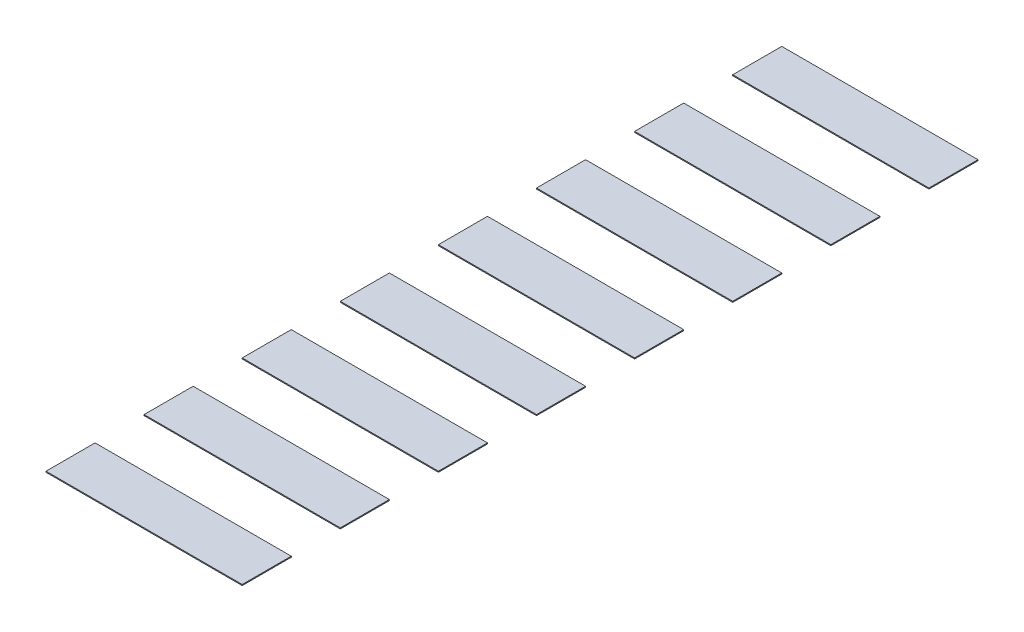
ISO-10303-21;
HEADER;
FILE_DESCRIPTION(('STEP AP214'),'2;1');
FILE_NAME('part.step','',(''),(''),'','','');
FILE_SCHEMA(('AUTOMOTIVE_DESIGN { 1 0 10303 214 1 1 1 1 }'));
ENDSEC;
DATA;
#1=APPLICATION_CONTEXT('core data for automotive mechanical design processes');
#2=APPLICATION_PROTOCOL_DEFINITION('international standard','automotive_design',2000,#1);
#3=PRODUCT_CONTEXT('',#1,'mechanical');
#4=PRODUCT('Part','Part','',(#3));
#5=PRODUCT_RELATED_PRODUCT_CATEGORY('part','',(#4));
#6=PRODUCT_DEFINITION_FORMATION('','',#4);
#7=PRODUCT_DEFINITION_CONTEXT('part definition',#1,'design');
#8=PRODUCT_DEFINITION('design','',#6,#7);
#9=PRODUCT_DEFINITION_SHAPE('','',#8);
#10=(LENGTH_UNIT() NAMED_UNIT(*) SI_UNIT(.MILLI.,.METRE.));
#11=(NAMED_UNIT(*) PLANE_ANGLE_UNIT() SI_UNIT($,.RADIAN.));
#12=(NAMED_UNIT(*) SI_UNIT($,.STERADIAN.) SOLID_ANGLE_UNIT());
#13=UNCERTAINTY_MEASURE_WITH_UNIT(LENGTH_MEASURE(1.E-05),#10,'distance_accuracy_value','');
#14=(GEOMETRIC_REPRESENTATION_CONTEXT(3) GLOBAL_UNCERTAINTY_ASSIGNED_CONTEXT((#13)) GLOBAL_UNIT_ASSIGNED_CONTEXT((#10,
#11,#12)) REPRESENTATION_CONTEXT('',''));
#15=CARTESIAN_POINT('',(0.,0.,0.));
#16=DIRECTION('',(0.,0.,1.));
#17=DIRECTION('',(1.,0.,0.));
#18=AXIS2_PLACEMENT_3D('',#15,#16,#17);
#19=CARTESIAN_POINT('',(0.,0.5,350.));
#20=DIRECTION('',(1.,0.,0.));
#21=DIRECTION('',(0.,0.,-1.));
#22=AXIS2_PLACEMENT_3D('',#19,#20,#21);
#23=PLANE('',#22);
#24=DIRECTION('',(0.,0.,1.));
#25=VECTOR('',#24,1.);
#26=CARTESIAN_POINT('',(0.,0.,350.));
#27=LINE('',#26,#25);
#28=CARTESIAN_POINT('',(0.,0.,350.));
#29=VERTEX_POINT('',#28);
#30=CARTESIAN_POINT('',(0.,0.,375.));
#31=VERTEX_POINT('',#30);
#32=EDGE_CURVE('E109',#29,#31,#27,.T.);
#33=ORIENTED_EDGE('',*,*,#32,.T.);
#34=DIRECTION('',(0.,-1.,0.));
#35=VECTOR('',#34,1.);
#36=CARTESIAN_POINT('',(0.,0.5,375.));
#37=LINE('',#36,#35);
#38=CARTESIAN_POINT('',(0.,0.5,375.));
#39=VERTEX_POINT('',#38);
#40=EDGE_CURVE('E12',#39,#31,#37,.T.);
#41=ORIENTED_EDGE('',*,*,#40,.F.);
#42=DIRECTION('',(0.,0.,1.));
#43=VECTOR('',#42,1.);
#44=CARTESIAN_POINT('',(0.,0.5,350.));
#45=LINE('',#44,#43);
#46=CARTESIAN_POINT('',(0.,0.5,350.));
#47=VERTEX_POINT('',#46);
#48=EDGE_CURVE('E97',#47,#39,#45,.T.);
#49=ORIENTED_EDGE('',*,*,#48,.F.);
#50=DIRECTION('',(0.,-1.,0.));
#51=VECTOR('',#50,1.);
#52=CARTESIAN_POINT('',(0.,0.5,350.));
#53=LINE('',#52,#51);
#54=EDGE_CURVE('E105',#47,#29,#53,.T.);
#55=ORIENTED_EDGE('',*,*,#54,.T.);
#56=EDGE_LOOP('',(#33,#41,#49,#55));
#57=FACE_BOUND('',#56,.T.);
#58=ADVANCED_FACE('F46',(#57),#23,.F.);
#59=CARTESIAN_POINT('',(0.,0.5,375.));
#60=DIRECTION('',(0.,0.,-1.));
#61=DIRECTION('',(-1.,0.,0.));
#62=AXIS2_PLACEMENT_3D('',#59,#60,#61);
#63=PLANE('',#62);
#64=DIRECTION('',(1.,0.,0.));
#65=VECTOR('',#64,1.);
#66=CARTESIAN_POINT('',(0.,0.,375.));
#67=LINE('',#66,#65);
#68=CARTESIAN_POINT('',(100.,0.,375.));
#69=VERTEX_POINT('',#68);
#70=EDGE_CURVE('E101',#31,#69,#67,.T.);
#71=ORIENTED_EDGE('',*,*,#70,.T.);
#72=DIRECTION('',(0.,-1.,0.));
#73=VECTOR('',#72,1.);
#74=CARTESIAN_POINT('',(100.,0.5,375.));
#75=LINE('',#74,#73);
#76=CARTESIAN_POINT('',(100.,0.5,375.));
#77=VERTEX_POINT('',#76);
#78=EDGE_CURVE('E54',#77,#69,#75,.T.);
#79=ORIENTED_EDGE('',*,*,#78,.F.);
#80=DIRECTION('',(1.,0.,0.));
#81=VECTOR('',#80,1.);
#82=CARTESIAN_POINT('',(0.,0.5,375.));
#83=LINE('',#82,#81);
#84=EDGE_CURVE('E92',#39,#77,#83,.T.);
#85=ORIENTED_EDGE('',*,*,#84,.F.);
#86=ORIENTED_EDGE('',*,*,#40,.T.);
#87=EDGE_LOOP('',(#71,#79,#85,#86));
#88=FACE_BOUND('',#87,.T.);
#89=ADVANCED_FACE('F100',(#88),#63,.F.);
#90=CARTESIAN_POINT('',(100.,0.5,350.));
#91=DIRECTION('',(-1.,0.,0.));
#92=DIRECTION('',(0.,0.,1.));
#93=AXIS2_PLACEMENT_3D('',#90,#91,#92);
#94=PLANE('',#93);
#95=DIRECTION('',(0.,0.,-1.));
#96=VECTOR('',#95,1.);
#97=CARTESIAN_POINT('',(100.,0.,350.));
#98=LINE('',#97,#96);
#99=CARTESIAN_POINT('',(100.,0.,350.));
#100=VERTEX_POINT('',#99);
#101=EDGE_CURVE('E79',#69,#100,#98,.T.);
#102=ORIENTED_EDGE('',*,*,#101,.T.);
#103=DIRECTION('',(0.,-1.,0.));
#104=VECTOR('',#103,1.);
#105=CARTESIAN_POINT('',(100.,0.5,350.));
#106=LINE('',#105,#104);
#107=CARTESIAN_POINT('',(100.,0.5,350.));
#108=VERTEX_POINT('',#107);
#109=EDGE_CURVE('E102',#108,#100,#106,.T.);
#110=ORIENTED_EDGE('',*,*,#109,.F.);
#111=DIRECTION('',(0.,0.,-1.));
#112=VECTOR('',#111,1.);
#113=CARTESIAN_POINT('',(100.,0.5,350.));
#114=LINE('',#113,#112);
#115=EDGE_CURVE('E95',#77,#108,#114,.T.);
#116=ORIENTED_EDGE('',*,*,#115,.F.);
#117=ORIENTED_EDGE('',*,*,#78,.T.);
#118=EDGE_LOOP('',(#102,#110,#116,#117));
#119=FACE_BOUND('',#118,.T.);
#120=ADVANCED_FACE('F103',(#119),#94,.F.);
#121=CARTESIAN_POINT('',(0.,0.5,350.));
#122=DIRECTION('',(0.,0.,1.));
#123=DIRECTION('',(1.,0.,0.));
#124=AXIS2_PLACEMENT_3D('',#121,#122,#123);
#125=PLANE('',#124);
#126=DIRECTION('',(-1.,0.,0.));
#127=VECTOR('',#126,1.);
#128=CARTESIAN_POINT('',(0.,0.,350.));
#129=LINE('',#128,#127);
#130=EDGE_CURVE('E85',#100,#29,#129,.T.);
#131=ORIENTED_EDGE('',*,*,#130,.T.);
#132=ORIENTED_EDGE('',*,*,#54,.F.);
#133=DIRECTION('',(-1.,0.,0.));
#134=VECTOR('',#133,1.);
#135=CARTESIAN_POINT('',(0.,0.5,350.));
#136=LINE('',#135,#134);
#137=EDGE_CURVE('E62',#108,#47,#136,.T.);
#138=ORIENTED_EDGE('',*,*,#137,.F.);
#139=ORIENTED_EDGE('',*,*,#109,.T.);
#140=EDGE_LOOP('',(#131,#132,#138,#139));
#141=FACE_BOUND('',#140,.T.);
#142=ADVANCED_FACE('F116',(#141),#125,.F.);
#143=CARTESIAN_POINT('',(0.,0.5,0.));
#144=DIRECTION('',(0.,1.,0.));
#145=DIRECTION('',(0.,0.,1.));
#146=AXIS2_PLACEMENT_3D('',#143,#144,#145);
#147=PLANE('',#146);
#148=ORIENTED_EDGE('',*,*,#48,.T.);
#149=ORIENTED_EDGE('',*,*,#84,.T.);
#150=ORIENTED_EDGE('',*,*,#115,.T.);
#151=ORIENTED_EDGE('',*,*,#137,.T.);
#152=EDGE_LOOP('',(#148,#149,#150,#151));
#153=FACE_BOUND('',#152,.T.);
#154=ADVANCED_FACE('F93',(#153),#147,.T.);
#155=CARTESIAN_POINT('',(0.,0.,0.));
#156=DIRECTION('',(0.,1.,0.));
#157=DIRECTION('',(0.,0.,1.));
#158=AXIS2_PLACEMENT_3D('',#155,#156,#157);
#159=PLANE('',#158);
#160=ORIENTED_EDGE('',*,*,#32,.F.);
#161=ORIENTED_EDGE('',*,*,#130,.F.);
#162=ORIENTED_EDGE('',*,*,#101,.F.);
#163=ORIENTED_EDGE('',*,*,#70,.F.);
#164=EDGE_LOOP('',(#160,#161,#162,#163));
#165=FACE_BOUND('',#164,.T.);
#166=ADVANCED_FACE('F119',(#165),#159,.F.);
#167=CLOSED_SHELL('',(#58,#89,#120,#142,#154,#166));
#168=MANIFOLD_SOLID_BREP('B2',#167);
#169=CARTESIAN_POINT('',(0.,0.5,300.));
#170=DIRECTION('',(0.,0.,1.));
#171=DIRECTION('',(1.,0.,0.));
#172=AXIS2_PLACEMENT_3D('',#169,#170,#171);
#173=PLANE('',#172);
#174=DIRECTION('',(-1.,0.,0.));
#175=VECTOR('',#174,1.);
#176=CARTESIAN_POINT('',(0.,0.,300.));
#177=LINE('',#176,#175);
#178=CARTESIAN_POINT('',(100.,0.,300.));
#179=VERTEX_POINT('',#178);
#180=CARTESIAN_POINT('',(0.,0.,300.));
#181=VERTEX_POINT('',#180);
#182=EDGE_CURVE('E243',#179,#181,#177,.T.);
#183=ORIENTED_EDGE('',*,*,#182,.T.);
#184=DIRECTION('',(0.,-1.,0.));
#185=VECTOR('',#184,1.);
#186=CARTESIAN_POINT('',(0.,0.5,300.));
#187=LINE('',#186,#185);
#188=CARTESIAN_POINT('',(0.,0.5,300.));
#189=VERTEX_POINT('',#188);
#190=EDGE_CURVE('E44',#189,#181,#187,.T.);
#191=ORIENTED_EDGE('',*,*,#190,.F.);
#192=DIRECTION('',(-1.,0.,0.));
#193=VECTOR('',#192,1.);
#194=CARTESIAN_POINT('',(0.,0.5,300.));
#195=LINE('',#194,#193);
#196=CARTESIAN_POINT('',(100.,0.5,300.));
#197=VERTEX_POINT('',#196);
#198=EDGE_CURVE('E231',#197,#189,#195,.T.);
#199=ORIENTED_EDGE('',*,*,#198,.F.);
#200=DIRECTION('',(0.,-1.,0.));
#201=VECTOR('',#200,1.);
#202=CARTESIAN_POINT('',(100.,0.5,300.));
#203=LINE('',#202,#201);
#204=EDGE_CURVE('E239',#197,#179,#203,.T.);
#205=ORIENTED_EDGE('',*,*,#204,.T.);
#206=EDGE_LOOP('',(#183,#191,#199,#205));
#207=FACE_BOUND('',#206,.T.);
#208=ADVANCED_FACE('F180',(#207),#173,.F.);
#209=CARTESIAN_POINT('',(0.,0.5,300.));
#210=DIRECTION('',(1.,0.,0.));
#211=DIRECTION('',(0.,0.,-1.));
#212=AXIS2_PLACEMENT_3D('',#209,#210,#211);
#213=PLANE('',#212);
#214=DIRECTION('',(0.,0.,1.));
#215=VECTOR('',#214,1.);
#216=CARTESIAN_POINT('',(0.,0.,300.));
#217=LINE('',#216,#215);
#218=CARTESIAN_POINT('',(0.,0.,325.));
#219=VERTEX_POINT('',#218);
#220=EDGE_CURVE('E235',#181,#219,#217,.T.);
#221=ORIENTED_EDGE('',*,*,#220,.T.);
#222=DIRECTION('',(0.,-1.,0.));
#223=VECTOR('',#222,1.);
#224=CARTESIAN_POINT('',(0.,0.5,325.));
#225=LINE('',#224,#223);
#226=CARTESIAN_POINT('',(0.,0.5,325.));
#227=VERTEX_POINT('',#226);
#228=EDGE_CURVE('E188',#227,#219,#225,.T.);
#229=ORIENTED_EDGE('',*,*,#228,.F.);
#230=DIRECTION('',(0.,0.,1.));
#231=VECTOR('',#230,1.);
#232=CARTESIAN_POINT('',(0.,0.5,300.));
#233=LINE('',#232,#231);
#234=EDGE_CURVE('E226',#189,#227,#233,.T.);
#235=ORIENTED_EDGE('',*,*,#234,.F.);
#236=ORIENTED_EDGE('',*,*,#190,.T.);
#237=EDGE_LOOP('',(#221,#229,#235,#236));
#238=FACE_BOUND('',#237,.T.);
#239=ADVANCED_FACE('F234',(#238),#213,.F.);
#240=CARTESIAN_POINT('',(0.,0.5,325.));
#241=DIRECTION('',(0.,0.,-1.));
#242=DIRECTION('',(-1.,0.,0.));
#243=AXIS2_PLACEMENT_3D('',#240,#241,#242);
#244=PLANE('',#243);
#245=DIRECTION('',(1.,0.,0.));
#246=VECTOR('',#245,1.);
#247=CARTESIAN_POINT('',(0.,0.,325.));
#248=LINE('',#247,#246);
#249=CARTESIAN_POINT('',(100.,0.,325.));
#250=VERTEX_POINT('',#249);
#251=EDGE_CURVE('E213',#219,#250,#248,.T.);
#252=ORIENTED_EDGE('',*,*,#251,.T.);
#253=DIRECTION('',(0.,-1.,0.));
#254=VECTOR('',#253,1.);
#255=CARTESIAN_POINT('',(100.,0.5,325.));
#256=LINE('',#255,#254);
#257=CARTESIAN_POINT('',(100.,0.5,325.));
#258=VERTEX_POINT('',#257);
#259=EDGE_CURVE('E236',#258,#250,#256,.T.);
#260=ORIENTED_EDGE('',*,*,#259,.F.);
#261=DIRECTION('',(1.,0.,0.));
#262=VECTOR('',#261,1.);
#263=CARTESIAN_POINT('',(0.,0.5,325.));
#264=LINE('',#263,#262);
#265=EDGE_CURVE('E229',#227,#258,#264,.T.);
#266=ORIENTED_EDGE('',*,*,#265,.F.);
#267=ORIENTED_EDGE('',*,*,#228,.T.);
#268=EDGE_LOOP('',(#252,#260,#266,#267));
#269=FACE_BOUND('',#268,.T.);
#270=ADVANCED_FACE('F237',(#269),#244,.F.);
#271=CARTESIAN_POINT('',(100.,0.5,300.));
#272=DIRECTION('',(-1.,0.,0.));
#273=DIRECTION('',(0.,0.,1.));
#274=AXIS2_PLACEMENT_3D('',#271,#272,#273);
#275=PLANE('',#274);
#276=DIRECTION('',(0.,0.,-1.));
#277=VECTOR('',#276,1.);
#278=CARTESIAN_POINT('',(100.,0.,300.));
#279=LINE('',#278,#277);
#280=EDGE_CURVE('E219',#250,#179,#279,.T.);
#281=ORIENTED_EDGE('',*,*,#280,.T.);
#282=ORIENTED_EDGE('',*,*,#204,.F.);
#283=DIRECTION('',(0.,0.,-1.));
#284=VECTOR('',#283,1.);
#285=CARTESIAN_POINT('',(100.,0.5,300.));
#286=LINE('',#285,#284);
#287=EDGE_CURVE('E196',#258,#197,#286,.T.);
#288=ORIENTED_EDGE('',*,*,#287,.F.);
#289=ORIENTED_EDGE('',*,*,#259,.T.);
#290=EDGE_LOOP('',(#281,#282,#288,#289));
#291=FACE_BOUND('',#290,.T.);
#292=ADVANCED_FACE('F250',(#291),#275,.F.);
#293=CARTESIAN_POINT('',(0.,0.5,0.));
#294=DIRECTION('',(0.,-1.,0.));
#295=DIRECTION('',(0.,0.,-1.));
#296=AXIS2_PLACEMENT_3D('',#293,#294,#295);
#297=PLANE('',#296);
#298=ORIENTED_EDGE('',*,*,#198,.T.);
#299=ORIENTED_EDGE('',*,*,#234,.T.);
#300=ORIENTED_EDGE('',*,*,#265,.T.);
#301=ORIENTED_EDGE('',*,*,#287,.T.);
#302=EDGE_LOOP('',(#298,#299,#300,#301));
#303=FACE_BOUND('',#302,.T.);
#304=ADVANCED_FACE('F227',(#303),#297,.F.);
#305=CARTESIAN_POINT('',(0.,0.,0.));
#306=DIRECTION('',(0.,-1.,0.));
#307=DIRECTION('',(0.,0.,-1.));
#308=AXIS2_PLACEMENT_3D('',#305,#306,#307);
#309=PLANE('',#308);
#310=ORIENTED_EDGE('',*,*,#182,.F.);
#311=ORIENTED_EDGE('',*,*,#280,.F.);
#312=ORIENTED_EDGE('',*,*,#251,.F.);
#313=ORIENTED_EDGE('',*,*,#220,.F.);
#314=EDGE_LOOP('',(#310,#311,#312,#313));
#315=FACE_BOUND('',#314,.T.);
#316=ADVANCED_FACE('F253',(#315),#309,.T.);
#317=CLOSED_SHELL('',(#208,#239,#270,#292,#304,#316));
#318=MANIFOLD_SOLID_BREP('B6',#317);
#319=CARTESIAN_POINT('',(0.,0.5,250.));
#320=DIRECTION('',(0.,0.,1.));
#321=DIRECTION('',(1.,0.,0.));
#322=AXIS2_PLACEMENT_3D('',#319,#320,#321);
#323=PLANE('',#322);
#324=DIRECTION('',(-1.,0.,0.));
#325=VECTOR('',#324,1.);
#326=CARTESIAN_POINT('',(0.,0.,250.));
#327=LINE('',#326,#325);
#328=CARTESIAN_POINT('',(100.,0.,250.));
#329=VERTEX_POINT('',#328);
#330=CARTESIAN_POINT('',(0.,0.,250.));
#331=VERTEX_POINT('',#330);
#332=EDGE_CURVE('E377',#329,#331,#327,.T.);
#333=ORIENTED_EDGE('',*,*,#332,.T.);
#334=DIRECTION('',(0.,-1.,0.));
#335=VECTOR('',#334,1.);
#336=CARTESIAN_POINT('',(0.,0.5,250.));
#337=LINE('',#336,#335);
#338=CARTESIAN_POINT('',(0.,0.5,250.));
#339=VERTEX_POINT('',#338);
#340=EDGE_CURVE('E178',#339,#331,#337,.T.);
#341=ORIENTED_EDGE('',*,*,#340,.F.);
#342=DIRECTION('',(-1.,0.,0.));
#343=VECTOR('',#342,1.);
#344=CARTESIAN_POINT('',(0.,0.5,250.));
#345=LINE('',#344,#343);
#346=CARTESIAN_POINT('',(100.,0.5,250.));
#347=VERTEX_POINT('',#346);
#348=EDGE_CURVE('E365',#347,#339,#345,.T.);
#349=ORIENTED_EDGE('',*,*,#348,.F.);
#350=DIRECTION('',(0.,-1.,0.));
#351=VECTOR('',#350,1.);
#352=CARTESIAN_POINT('',(100.,0.5,250.));
#353=LINE('',#352,#351);
#354=EDGE_CURVE('E373',#347,#329,#353,.T.);
#355=ORIENTED_EDGE('',*,*,#354,.T.);
#356=EDGE_LOOP('',(#333,#341,#349,#355));
#357=FACE_BOUND('',#356,.T.);
#358=ADVANCED_FACE('F314',(#357),#323,.F.);
#359=CARTESIAN_POINT('',(0.,0.5,250.));
#360=DIRECTION('',(1.,0.,0.));
#361=DIRECTION('',(0.,0.,-1.));
#362=AXIS2_PLACEMENT_3D('',#359,#360,#361);
#363=PLANE('',#362);
#364=DIRECTION('',(0.,0.,1.));
#365=VECTOR('',#364,1.);
#366=CARTESIAN_POINT('',(0.,0.,250.));
#367=LINE('',#366,#365);
#368=CARTESIAN_POINT('',(0.,0.,275.));
#369=VERTEX_POINT('',#368);
#370=EDGE_CURVE('E369',#331,#369,#367,.T.);
#371=ORIENTED_EDGE('',*,*,#370,.T.);
#372=DIRECTION('',(0.,-1.,0.));
#373=VECTOR('',#372,1.);
#374=CARTESIAN_POINT('',(0.,0.5,275.));
#375=LINE('',#374,#373);
#376=CARTESIAN_POINT('',(0.,0.5,275.));
#377=VERTEX_POINT('',#376);
#378=EDGE_CURVE('E322',#377,#369,#375,.T.);
#379=ORIENTED_EDGE('',*,*,#378,.F.);
#380=DIRECTION('',(0.,0.,1.));
#381=VECTOR('',#380,1.);
#382=CARTESIAN_POINT('',(0.,0.5,250.));
#383=LINE('',#382,#381);
#384=EDGE_CURVE('E360',#339,#377,#383,.T.);
#385=ORIENTED_EDGE('',*,*,#384,.F.);
#386=ORIENTED_EDGE('',*,*,#340,.T.);
#387=EDGE_LOOP('',(#371,#379,#385,#386));
#388=FACE_BOUND('',#387,.T.);
#389=ADVANCED_FACE('F368',(#388),#363,.F.);
#390=CARTESIAN_POINT('',(0.,0.5,275.));
#391=DIRECTION('',(0.,0.,-1.));
#392=DIRECTION('',(-1.,0.,0.));
#393=AXIS2_PLACEMENT_3D('',#390,#391,#392);
#394=PLANE('',#393);
#395=DIRECTION('',(1.,0.,0.));
#396=VECTOR('',#395,1.);
#397=CARTESIAN_POINT('',(0.,0.,275.));
#398=LINE('',#397,#396);
#399=CARTESIAN_POINT('',(100.,0.,275.));
#400=VERTEX_POINT('',#399);
#401=EDGE_CURVE('E347',#369,#400,#398,.T.);
#402=ORIENTED_EDGE('',*,*,#401,.T.);
#403=DIRECTION('',(0.,-1.,0.));
#404=VECTOR('',#403,1.);
#405=CARTESIAN_POINT('',(100.,0.5,275.));
#406=LINE('',#405,#404);
#407=CARTESIAN_POINT('',(100.,0.5,275.));
#408=VERTEX_POINT('',#407);
#409=EDGE_CURVE('E370',#408,#400,#406,.T.);
#410=ORIENTED_EDGE('',*,*,#409,.F.);
#411=DIRECTION('',(1.,0.,0.));
#412=VECTOR('',#411,1.);
#413=CARTESIAN_POINT('',(0.,0.5,275.));
#414=LINE('',#413,#412);
#415=EDGE_CURVE('E363',#377,#408,#414,.T.);
#416=ORIENTED_EDGE('',*,*,#415,.F.);
#417=ORIENTED_EDGE('',*,*,#378,.T.);
#418=EDGE_LOOP('',(#402,#410,#416,#417));
#419=FACE_BOUND('',#418,.T.);
#420=ADVANCED_FACE('F371',(#419),#394,.F.);
#421=CARTESIAN_POINT('',(100.,0.5,250.));
#422=DIRECTION('',(-1.,0.,0.));
#423=DIRECTION('',(0.,0.,1.));
#424=AXIS2_PLACEMENT_3D('',#421,#422,#423);
#425=PLANE('',#424);
#426=DIRECTION('',(0.,0.,-1.));
#427=VECTOR('',#426,1.);
#428=CARTESIAN_POINT('',(100.,0.,250.));
#429=LINE('',#428,#427);
#430=EDGE_CURVE('E353',#400,#329,#429,.T.);
#431=ORIENTED_EDGE('',*,*,#430,.T.);
#432=ORIENTED_EDGE('',*,*,#354,.F.);
#433=DIRECTION('',(0.,0.,-1.));
#434=VECTOR('',#433,1.);
#435=CARTESIAN_POINT('',(100.,0.5,250.));
#436=LINE('',#435,#434);
#437=EDGE_CURVE('E330',#408,#347,#436,.T.);
#438=ORIENTED_EDGE('',*,*,#437,.F.);
#439=ORIENTED_EDGE('',*,*,#409,.T.);
#440=EDGE_LOOP('',(#431,#432,#438,#439));
#441=FACE_BOUND('',#440,.T.);
#442=ADVANCED_FACE('F384',(#441),#425,.F.);
#443=CARTESIAN_POINT('',(0.,0.5,0.));
#444=DIRECTION('',(0.,-1.,0.));
#445=DIRECTION('',(0.,0.,-1.));
#446=AXIS2_PLACEMENT_3D('',#443,#444,#445);
#447=PLANE('',#446);
#448=ORIENTED_EDGE('',*,*,#348,.T.);
#449=ORIENTED_EDGE('',*,*,#384,.T.);
#450=ORIENTED_EDGE('',*,*,#415,.T.);
#451=ORIENTED_EDGE('',*,*,#437,.T.);
#452=EDGE_LOOP('',(#448,#449,#450,#451));
#453=FACE_BOUND('',#452,.T.);
#454=ADVANCED_FACE('F361',(#453),#447,.F.);
#455=CARTESIAN_POINT('',(0.,0.,0.));
#456=DIRECTION('',(0.,-1.,0.));
#457=DIRECTION('',(0.,0.,-1.));
#458=AXIS2_PLACEMENT_3D('',#455,#456,#457);
#459=PLANE('',#458);
#460=ORIENTED_EDGE('',*,*,#332,.F.);
#461=ORIENTED_EDGE('',*,*,#430,.F.);
#462=ORIENTED_EDGE('',*,*,#401,.F.);
#463=ORIENTED_EDGE('',*,*,#370,.F.);
#464=EDGE_LOOP('',(#460,#461,#462,#463));
#465=FACE_BOUND('',#464,.T.);
#466=ADVANCED_FACE('F387',(#465),#459,.T.);
#467=CLOSED_SHELL('',(#358,#389,#420,#442,#454,#466));
#468=MANIFOLD_SOLID_BREP('B38',#467);
#469=CARTESIAN_POINT('',(0.,0.5,200.));
#470=DIRECTION('',(1.,0.,0.));
#471=DIRECTION('',(0.,0.,-1.));
#472=AXIS2_PLACEMENT_3D('',#469,#470,#471);
#473=PLANE('',#472);
#474=DIRECTION('',(0.,0.,1.));
#475=VECTOR('',#474,1.);
#476=CARTESIAN_POINT('',(0.,0.,200.));
#477=LINE('',#476,#475);
#478=CARTESIAN_POINT('',(0.,0.,200.));
#479=VERTEX_POINT('',#478);
#480=CARTESIAN_POINT('',(0.,0.,225.));
#481=VERTEX_POINT('',#480);
#482=EDGE_CURVE('E511',#479,#481,#477,.T.);
#483=ORIENTED_EDGE('',*,*,#482,.T.);
#484=DIRECTION('',(0.,-1.,0.));
#485=VECTOR('',#484,1.);
#486=CARTESIAN_POINT('',(0.,0.5,225.));
#487=LINE('',#486,#485);
#488=CARTESIAN_POINT('',(0.,0.5,225.));
#489=VERTEX_POINT('',#488);
#490=EDGE_CURVE('E312',#489,#481,#487,.T.);
#491=ORIENTED_EDGE('',*,*,#490,.F.);
#492=DIRECTION('',(0.,0.,1.));
#493=VECTOR('',#492,1.);
#494=CARTESIAN_POINT('',(0.,0.5,200.));
#495=LINE('',#494,#493);
#496=CARTESIAN_POINT('',(0.,0.5,200.));
#497=VERTEX_POINT('',#496);
#498=EDGE_CURVE('E499',#497,#489,#495,.T.);
#499=ORIENTED_EDGE('',*,*,#498,.F.);
#500=DIRECTION('',(0.,-1.,0.));
#501=VECTOR('',#500,1.);
#502=CARTESIAN_POINT('',(0.,0.5,200.));
#503=LINE('',#502,#501);
#504=EDGE_CURVE('E507',#497,#479,#503,.T.);
#505=ORIENTED_EDGE('',*,*,#504,.T.);
#506=EDGE_LOOP('',(#483,#491,#499,#505));
#507=FACE_BOUND('',#506,.T.);
#508=ADVANCED_FACE('F448',(#507),#473,.F.);
#509=CARTESIAN_POINT('',(0.,0.5,225.));
#510=DIRECTION('',(0.,0.,-1.));
#511=DIRECTION('',(-1.,0.,0.));
#512=AXIS2_PLACEMENT_3D('',#509,#510,#511);
#513=PLANE('',#512);
#514=DIRECTION('',(1.,0.,0.));
#515=VECTOR('',#514,1.);
#516=CARTESIAN_POINT('',(0.,0.,225.));
#517=LINE('',#516,#515);
#518=CARTESIAN_POINT('',(100.,0.,225.));
#519=VERTEX_POINT('',#518);
#520=EDGE_CURVE('E503',#481,#519,#517,.T.);
#521=ORIENTED_EDGE('',*,*,#520,.T.);
#522=DIRECTION('',(0.,-1.,0.));
#523=VECTOR('',#522,1.);
#524=CARTESIAN_POINT('',(100.,0.5,225.));
#525=LINE('',#524,#523);
#526=CARTESIAN_POINT('',(100.,0.5,225.));
#527=VERTEX_POINT('',#526);
#528=EDGE_CURVE('E456',#527,#519,#525,.T.);
#529=ORIENTED_EDGE('',*,*,#528,.F.);
#530=DIRECTION('',(1.,0.,0.));
#531=VECTOR('',#530,1.);
#532=CARTESIAN_POINT('',(0.,0.5,225.));
#533=LINE('',#532,#531);
#534=EDGE_CURVE('E494',#489,#527,#533,.T.);
#535=ORIENTED_EDGE('',*,*,#534,.F.);
#536=ORIENTED_EDGE('',*,*,#490,.T.);
#537=EDGE_LOOP('',(#521,#529,#535,#536));
#538=FACE_BOUND('',#537,.T.);
#539=ADVANCED_FACE('F502',(#538),#513,.F.);
#540=CARTESIAN_POINT('',(100.,0.5,200.));
#541=DIRECTION('',(-1.,0.,0.));
#542=DIRECTION('',(0.,0.,1.));
#543=AXIS2_PLACEMENT_3D('',#540,#541,#542);
#544=PLANE('',#543);
#545=DIRECTION('',(0.,0.,-1.));
#546=VECTOR('',#545,1.);
#547=CARTESIAN_POINT('',(100.,0.,200.));
#548=LINE('',#547,#546);
#549=CARTESIAN_POINT('',(100.,0.,200.));
#550=VERTEX_POINT('',#549);
#551=EDGE_CURVE('E481',#519,#550,#548,.T.);
#552=ORIENTED_EDGE('',*,*,#551,.T.);
#553=DIRECTION('',(0.,-1.,0.));
#554=VECTOR('',#553,1.);
#555=CARTESIAN_POINT('',(100.,0.5,200.));
#556=LINE('',#555,#554);
#557=CARTESIAN_POINT('',(100.,0.5,200.));
#558=VERTEX_POINT('',#557);
#559=EDGE_CURVE('E504',#558,#550,#556,.T.);
#560=ORIENTED_EDGE('',*,*,#559,.F.);
#561=DIRECTION('',(0.,0.,-1.));
#562=VECTOR('',#561,1.);
#563=CARTESIAN_POINT('',(100.,0.5,200.));
#564=LINE('',#563,#562);
#565=EDGE_CURVE('E497',#527,#558,#564,.T.);
#566=ORIENTED_EDGE('',*,*,#565,.F.);
#567=ORIENTED_EDGE('',*,*,#528,.T.);
#568=EDGE_LOOP('',(#552,#560,#566,#567));
#569=FACE_BOUND('',#568,.T.);
#570=ADVANCED_FACE('F505',(#569),#544,.F.);
#571=CARTESIAN_POINT('',(0.,0.5,200.));
#572=DIRECTION('',(0.,0.,1.));
#573=DIRECTION('',(1.,0.,0.));
#574=AXIS2_PLACEMENT_3D('',#571,#572,#573);
#575=PLANE('',#574);
#576=DIRECTION('',(-1.,0.,0.));
#577=VECTOR('',#576,1.);
#578=CARTESIAN_POINT('',(0.,0.,200.));
#579=LINE('',#578,#577);
#580=EDGE_CURVE('E487',#550,#479,#579,.T.);
#581=ORIENTED_EDGE('',*,*,#580,.T.);
#582=ORIENTED_EDGE('',*,*,#504,.F.);
#583=DIRECTION('',(-1.,0.,0.));
#584=VECTOR('',#583,1.);
#585=CARTESIAN_POINT('',(0.,0.5,200.));
#586=LINE('',#585,#584);
#587=EDGE_CURVE('E464',#558,#497,#586,.T.);
#588=ORIENTED_EDGE('',*,*,#587,.F.);
#589=ORIENTED_EDGE('',*,*,#559,.T.);
#590=EDGE_LOOP('',(#581,#582,#588,#589));
#591=FACE_BOUND('',#590,.T.);
#592=ADVANCED_FACE('F518',(#591),#575,.F.);
#593=CARTESIAN_POINT('',(0.,0.5,0.));
#594=DIRECTION('',(0.,1.,0.));
#595=DIRECTION('',(0.,0.,1.));
#596=AXIS2_PLACEMENT_3D('',#593,#594,#595);
#597=PLANE('',#596);
#598=ORIENTED_EDGE('',*,*,#498,.T.);
#599=ORIENTED_EDGE('',*,*,#534,.T.);
#600=ORIENTED_EDGE('',*,*,#565,.T.);
#601=ORIENTED_EDGE('',*,*,#587,.T.);
#602=EDGE_LOOP('',(#598,#599,#600,#601));
#603=FACE_BOUND('',#602,.T.);
#604=ADVANCED_FACE('F495',(#603),#597,.T.);
#605=CARTESIAN_POINT('',(0.,0.,0.));
#606=DIRECTION('',(0.,1.,0.));
#607=DIRECTION('',(0.,0.,1.));
#608=AXIS2_PLACEMENT_3D('',#605,#606,#607);
#609=PLANE('',#608);
#610=ORIENTED_EDGE('',*,*,#482,.F.);
#611=ORIENTED_EDGE('',*,*,#580,.F.);
#612=ORIENTED_EDGE('',*,*,#551,.F.);
#613=ORIENTED_EDGE('',*,*,#520,.F.);
#614=EDGE_LOOP('',(#610,#611,#612,#613));
#615=FACE_BOUND('',#614,.T.);
#616=ADVANCED_FACE('F521',(#615),#609,.F.);
#617=CLOSED_SHELL('',(#508,#539,#570,#592,#604,#616));
#618=MANIFOLD_SOLID_BREP('B172',#617);
#619=CARTESIAN_POINT('',(0.,0.5,150.));
#620=DIRECTION('',(0.,0.,1.));
#621=DIRECTION('',(1.,0.,0.));
#622=AXIS2_PLACEMENT_3D('',#619,#620,#621);
#623=PLANE('',#622);
#624=DIRECTION('',(-1.,0.,0.));
#625=VECTOR('',#624,1.);
#626=CARTESIAN_POINT('',(0.,0.,150.));
#627=LINE('',#626,#625);
#628=CARTESIAN_POINT('',(100.,0.,150.));
#629=VERTEX_POINT('',#628);
#630=CARTESIAN_POINT('',(0.,0.,150.));
#631=VERTEX_POINT('',#630);
#632=EDGE_CURVE('E645',#629,#631,#627,.T.);
#633=ORIENTED_EDGE('',*,*,#632,.T.);
#634=DIRECTION('',(0.,-1.,0.));
#635=VECTOR('',#634,1.);
#636=CARTESIAN_POINT('',(0.,0.5,150.));
#637=LINE('',#636,#635);
#638=CARTESIAN_POINT('',(0.,0.5,150.));
#639=VERTEX_POINT('',#638);
#640=EDGE_CURVE('E446',#639,#631,#637,.T.);
#641=ORIENTED_EDGE('',*,*,#640,.F.);
#642=DIRECTION('',(-1.,0.,0.));
#643=VECTOR('',#642,1.);
#644=CARTESIAN_POINT('',(0.,0.5,150.));
#645=LINE('',#644,#643);
#646=CARTESIAN_POINT('',(100.,0.5,150.));
#647=VERTEX_POINT('',#646);
#648=EDGE_CURVE('E633',#647,#639,#645,.T.);
#649=ORIENTED_EDGE('',*,*,#648,.F.);
#650=DIRECTION('',(0.,-1.,0.));
#651=VECTOR('',#650,1.);
#652=CARTESIAN_POINT('',(100.,0.5,150.));
#653=LINE('',#652,#651);
#654=EDGE_CURVE('E641',#647,#629,#653,.T.);
#655=ORIENTED_EDGE('',*,*,#654,.T.);
#656=EDGE_LOOP('',(#633,#641,#649,#655));
#657=FACE_BOUND('',#656,.T.);
#658=ADVANCED_FACE('F582',(#657),#623,.F.);
#659=CARTESIAN_POINT('',(0.,0.5,150.));
#660=DIRECTION('',(1.,0.,0.));
#661=DIRECTION('',(0.,0.,-1.));
#662=AXIS2_PLACEMENT_3D('',#659,#660,#661);
#663=PLANE('',#662);
#664=DIRECTION('',(0.,0.,1.));
#665=VECTOR('',#664,1.);
#666=CARTESIAN_POINT('',(0.,0.,150.));
#667=LINE('',#666,#665);
#668=CARTESIAN_POINT('',(0.,0.,175.));
#669=VERTEX_POINT('',#668);
#670=EDGE_CURVE('E637',#631,#669,#667,.T.);
#671=ORIENTED_EDGE('',*,*,#670,.T.);
#672=DIRECTION('',(0.,-1.,0.));
#673=VECTOR('',#672,1.);
#674=CARTESIAN_POINT('',(0.,0.5,175.));
#675=LINE('',#674,#673);
#676=CARTESIAN_POINT('',(0.,0.5,175.));
#677=VERTEX_POINT('',#676);
#678=EDGE_CURVE('E590',#677,#669,#675,.T.);
#679=ORIENTED_EDGE('',*,*,#678,.F.);
#680=DIRECTION('',(0.,0.,1.));
#681=VECTOR('',#680,1.);
#682=CARTESIAN_POINT('',(0.,0.5,150.));
#683=LINE('',#682,#681);
#684=EDGE_CURVE('E628',#639,#677,#683,.T.);
#685=ORIENTED_EDGE('',*,*,#684,.F.);
#686=ORIENTED_EDGE('',*,*,#640,.T.);
#687=EDGE_LOOP('',(#671,#679,#685,#686));
#688=FACE_BOUND('',#687,.T.);
#689=ADVANCED_FACE('F636',(#688),#663,.F.);
#690=CARTESIAN_POINT('',(0.,0.5,175.));
#691=DIRECTION('',(0.,0.,-1.));
#692=DIRECTION('',(-1.,0.,0.));
#693=AXIS2_PLACEMENT_3D('',#690,#691,#692);
#694=PLANE('',#693);
#695=DIRECTION('',(1.,0.,0.));
#696=VECTOR('',#695,1.);
#697=CARTESIAN_POINT('',(0.,0.,175.));
#698=LINE('',#697,#696);
#699=CARTESIAN_POINT('',(100.,0.,175.));
#700=VERTEX_POINT('',#699);
#701=EDGE_CURVE('E615',#669,#700,#698,.T.);
#702=ORIENTED_EDGE('',*,*,#701,.T.);
#703=DIRECTION('',(0.,-1.,0.));
#704=VECTOR('',#703,1.);
#705=CARTESIAN_POINT('',(100.,0.5,175.));
#706=LINE('',#705,#704);
#707=CARTESIAN_POINT('',(100.,0.5,175.));
#708=VERTEX_POINT('',#707);
#709=EDGE_CURVE('E638',#708,#700,#706,.T.);
#710=ORIENTED_EDGE('',*,*,#709,.F.);
#711=DIRECTION('',(1.,0.,0.));
#712=VECTOR('',#711,1.);
#713=CARTESIAN_POINT('',(0.,0.5,175.));
#714=LINE('',#713,#712);
#715=EDGE_CURVE('E631',#677,#708,#714,.T.);
#716=ORIENTED_EDGE('',*,*,#715,.F.);
#717=ORIENTED_EDGE('',*,*,#678,.T.);
#718=EDGE_LOOP('',(#702,#710,#716,#717));
#719=FACE_BOUND('',#718,.T.);
#720=ADVANCED_FACE('F639',(#719),#694,.F.);
#721=CARTESIAN_POINT('',(100.,0.5,150.));
#722=DIRECTION('',(-1.,0.,0.));
#723=DIRECTION('',(0.,0.,1.));
#724=AXIS2_PLACEMENT_3D('',#721,#722,#723);
#725=PLANE('',#724);
#726=DIRECTION('',(0.,0.,-1.));
#727=VECTOR('',#726,1.);
#728=CARTESIAN_POINT('',(100.,0.,150.));
#729=LINE('',#728,#727);
#730=EDGE_CURVE('E621',#700,#629,#729,.T.);
#731=ORIENTED_EDGE('',*,*,#730,.T.);
#732=ORIENTED_EDGE('',*,*,#654,.F.);
#733=DIRECTION('',(0.,0.,-1.));
#734=VECTOR('',#733,1.);
#735=CARTESIAN_POINT('',(100.,0.5,150.));
#736=LINE('',#735,#734);
#737=EDGE_CURVE('E598',#708,#647,#736,.T.);
#738=ORIENTED_EDGE('',*,*,#737,.F.);
#739=ORIENTED_EDGE('',*,*,#709,.T.);
#740=EDGE_LOOP('',(#731,#732,#738,#739));
#741=FACE_BOUND('',#740,.T.);
#742=ADVANCED_FACE('F652',(#741),#725,.F.);
#743=CARTESIAN_POINT('',(0.,0.5,0.));
#744=DIRECTION('',(0.,-1.,0.));
#745=DIRECTION('',(0.,0.,-1.));
#746=AXIS2_PLACEMENT_3D('',#743,#744,#745);
#747=PLANE('',#746);
#748=ORIENTED_EDGE('',*,*,#648,.T.);
#749=ORIENTED_EDGE('',*,*,#684,.T.);
#750=ORIENTED_EDGE('',*,*,#715,.T.);
#751=ORIENTED_EDGE('',*,*,#737,.T.);
#752=EDGE_LOOP('',(#748,#749,#750,#751));
#753=FACE_BOUND('',#752,.T.);
#754=ADVANCED_FACE('F629',(#753),#747,.F.);
#755=CARTESIAN_POINT('',(0.,0.,0.));
#756=DIRECTION('',(0.,-1.,0.));
#757=DIRECTION('',(0.,0.,-1.));
#758=AXIS2_PLACEMENT_3D('',#755,#756,#757);
#759=PLANE('',#758);
#760=ORIENTED_EDGE('',*,*,#632,.F.);
#761=ORIENTED_EDGE('',*,*,#730,.F.);
#762=ORIENTED_EDGE('',*,*,#701,.F.);
#763=ORIENTED_EDGE('',*,*,#670,.F.);
#764=EDGE_LOOP('',(#760,#761,#762,#763));
#765=FACE_BOUND('',#764,.T.);
#766=ADVANCED_FACE('F655',(#765),#759,.T.);
#767=CLOSED_SHELL('',(#658,#689,#720,#742,#754,#766));
#768=MANIFOLD_SOLID_BREP('B306',#767);
#769=CARTESIAN_POINT('',(0.,0.5,100.));
#770=DIRECTION('',(0.,0.,1.));
#771=DIRECTION('',(1.,0.,0.));
#772=AXIS2_PLACEMENT_3D('',#769,#770,#771);
#773=PLANE('',#772);
#774=DIRECTION('',(-1.,0.,0.));
#775=VECTOR('',#774,1.);
#776=CARTESIAN_POINT('',(0.,0.,100.));
#777=LINE('',#776,#775);
#778=CARTESIAN_POINT('',(100.,0.,100.));
#779=VERTEX_POINT('',#778);
#780=CARTESIAN_POINT('',(0.,0.,100.));
#781=VERTEX_POINT('',#780);
#782=EDGE_CURVE('E779',#779,#781,#777,.T.);
#783=ORIENTED_EDGE('',*,*,#782,.T.);
#784=DIRECTION('',(0.,-1.,0.));
#785=VECTOR('',#784,1.);
#786=CARTESIAN_POINT('',(0.,0.5,100.));
#787=LINE('',#786,#785);
#788=CARTESIAN_POINT('',(0.,0.5,100.));
#789=VERTEX_POINT('',#788);
#790=EDGE_CURVE('E580',#789,#781,#787,.T.);
#791=ORIENTED_EDGE('',*,*,#790,.F.);
#792=DIRECTION('',(-1.,0.,0.));
#793=VECTOR('',#792,1.);
#794=CARTESIAN_POINT('',(0.,0.5,100.));
#795=LINE('',#794,#793);
#796=CARTESIAN_POINT('',(100.,0.5,100.));
#797=VERTEX_POINT('',#796);
#798=EDGE_CURVE('E767',#797,#789,#795,.T.);
#799=ORIENTED_EDGE('',*,*,#798,.F.);
#800=DIRECTION('',(0.,-1.,0.));
#801=VECTOR('',#800,1.);
#802=CARTESIAN_POINT('',(100.,0.5,100.));
#803=LINE('',#802,#801);
#804=EDGE_CURVE('E775',#797,#779,#803,.T.);
#805=ORIENTED_EDGE('',*,*,#804,.T.);
#806=EDGE_LOOP('',(#783,#791,#799,#805));
#807=FACE_BOUND('',#806,.T.);
#808=ADVANCED_FACE('F716',(#807),#773,.F.);
#809=CARTESIAN_POINT('',(0.,0.5,100.));
#810=DIRECTION('',(1.,0.,0.));
#811=DIRECTION('',(0.,0.,-1.));
#812=AXIS2_PLACEMENT_3D('',#809,#810,#811);
#813=PLANE('',#812);
#814=DIRECTION('',(0.,0.,1.));
#815=VECTOR('',#814,1.);
#816=CARTESIAN_POINT('',(0.,0.,100.));
#817=LINE('',#816,#815);
#818=CARTESIAN_POINT('',(0.,0.,125.));
#819=VERTEX_POINT('',#818);
#820=EDGE_CURVE('E771',#781,#819,#817,.T.);
#821=ORIENTED_EDGE('',*,*,#820,.T.);
#822=DIRECTION('',(0.,-1.,0.));
#823=VECTOR('',#822,1.);
#824=CARTESIAN_POINT('',(0.,0.5,125.));
#825=LINE('',#824,#823);
#826=CARTESIAN_POINT('',(0.,0.5,125.));
#827=VERTEX_POINT('',#826);
#828=EDGE_CURVE('E724',#827,#819,#825,.T.);
#829=ORIENTED_EDGE('',*,*,#828,.F.);
#830=DIRECTION('',(0.,0.,1.));
#831=VECTOR('',#830,1.);
#832=CARTESIAN_POINT('',(0.,0.5,100.));
#833=LINE('',#832,#831);
#834=EDGE_CURVE('E762',#789,#827,#833,.T.);
#835=ORIENTED_EDGE('',*,*,#834,.F.);
#836=ORIENTED_EDGE('',*,*,#790,.T.);
#837=EDGE_LOOP('',(#821,#829,#835,#836));
#838=FACE_BOUND('',#837,.T.);
#839=ADVANCED_FACE('F770',(#838),#813,.F.);
#840=CARTESIAN_POINT('',(0.,0.5,125.));
#841=DIRECTION('',(0.,0.,-1.));
#842=DIRECTION('',(-1.,0.,0.));
#843=AXIS2_PLACEMENT_3D('',#840,#841,#842);
#844=PLANE('',#843);
#845=DIRECTION('',(1.,0.,0.));
#846=VECTOR('',#845,1.);
#847=CARTESIAN_POINT('',(0.,0.,125.));
#848=LINE('',#847,#846);
#849=CARTESIAN_POINT('',(100.,0.,125.));
#850=VERTEX_POINT('',#849);
#851=EDGE_CURVE('E749',#819,#850,#848,.T.);
#852=ORIENTED_EDGE('',*,*,#851,.T.);
#853=DIRECTION('',(0.,-1.,0.));
#854=VECTOR('',#853,1.);
#855=CARTESIAN_POINT('',(100.,0.5,125.));
#856=LINE('',#855,#854);
#857=CARTESIAN_POINT('',(100.,0.5,125.));
#858=VERTEX_POINT('',#857);
#859=EDGE_CURVE('E772',#858,#850,#856,.T.);
#860=ORIENTED_EDGE('',*,*,#859,.F.);
#861=DIRECTION('',(1.,0.,0.));
#862=VECTOR('',#861,1.);
#863=CARTESIAN_POINT('',(0.,0.5,125.));
#864=LINE('',#863,#862);
#865=EDGE_CURVE('E765',#827,#858,#864,.T.);
#866=ORIENTED_EDGE('',*,*,#865,.F.);
#867=ORIENTED_EDGE('',*,*,#828,.T.);
#868=EDGE_LOOP('',(#852,#860,#866,#867));
#869=FACE_BOUND('',#868,.T.);
#870=ADVANCED_FACE('F773',(#869),#844,.F.);
#871=CARTESIAN_POINT('',(100.,0.5,100.));
#872=DIRECTION('',(-1.,0.,0.));
#873=DIRECTION('',(0.,0.,1.));
#874=AXIS2_PLACEMENT_3D('',#871,#872,#873);
#875=PLANE('',#874);
#876=DIRECTION('',(0.,0.,-1.));
#877=VECTOR('',#876,1.);
#878=CARTESIAN_POINT('',(100.,0.,100.));
#879=LINE('',#878,#877);
#880=EDGE_CURVE('E755',#850,#779,#879,.T.);
#881=ORIENTED_EDGE('',*,*,#880,.T.);
#882=ORIENTED_EDGE('',*,*,#804,.F.);
#883=DIRECTION('',(0.,0.,-1.));
#884=VECTOR('',#883,1.);
#885=CARTESIAN_POINT('',(100.,0.5,100.));
#886=LINE('',#885,#884);
#887=EDGE_CURVE('E732',#858,#797,#886,.T.);
#888=ORIENTED_EDGE('',*,*,#887,.F.);
#889=ORIENTED_EDGE('',*,*,#859,.T.);
#890=EDGE_LOOP('',(#881,#882,#888,#889));
#891=FACE_BOUND('',#890,.T.);
#892=ADVANCED_FACE('F786',(#891),#875,.F.);
#893=CARTESIAN_POINT('',(0.,0.5,0.));
#894=DIRECTION('',(0.,-1.,0.));
#895=DIRECTION('',(0.,0.,-1.));
#896=AXIS2_PLACEMENT_3D('',#893,#894,#895);
#897=PLANE('',#896);
#898=ORIENTED_EDGE('',*,*,#798,.T.);
#899=ORIENTED_EDGE('',*,*,#834,.T.);
#900=ORIENTED_EDGE('',*,*,#865,.T.);
#901=ORIENTED_EDGE('',*,*,#887,.T.);
#902=EDGE_LOOP('',(#898,#899,#900,#901));
#903=FACE_BOUND('',#902,.T.);
#904=ADVANCED_FACE('F763',(#903),#897,.F.);
#905=CARTESIAN_POINT('',(0.,0.,0.));
#906=DIRECTION('',(0.,-1.,0.));
#907=DIRECTION('',(0.,0.,-1.));
#908=AXIS2_PLACEMENT_3D('',#905,#906,#907);
#909=PLANE('',#908);
#910=ORIENTED_EDGE('',*,*,#782,.F.);
#911=ORIENTED_EDGE('',*,*,#880,.F.);
#912=ORIENTED_EDGE('',*,*,#851,.F.);
#913=ORIENTED_EDGE('',*,*,#820,.F.);
#914=EDGE_LOOP('',(#910,#911,#912,#913));
#915=FACE_BOUND('',#914,.T.);
#916=ADVANCED_FACE('F789',(#915),#909,.T.);
#917=CLOSED_SHELL('',(#808,#839,#870,#892,#904,#916));
#918=MANIFOLD_SOLID_BREP('B440',#917);
#919=CARTESIAN_POINT('',(0.,0.5,50.));
#920=DIRECTION('',(1.,0.,0.));
#921=DIRECTION('',(0.,0.,-1.));
#922=AXIS2_PLACEMENT_3D('',#919,#920,#921);
#923=PLANE('',#922);
#924=DIRECTION('',(0.,0.,1.));
#925=VECTOR('',#924,1.);
#926=CARTESIAN_POINT('',(0.,0.,50.));
#927=LINE('',#926,#925);
#928=CARTESIAN_POINT('',(0.,0.,50.));
#929=VERTEX_POINT('',#928);
#930=CARTESIAN_POINT('',(0.,0.,75.));
#931=VERTEX_POINT('',#930);
#932=EDGE_CURVE('E912',#929,#931,#927,.T.);
#933=ORIENTED_EDGE('',*,*,#932,.T.);
#934=DIRECTION('',(0.,-1.,0.));
#935=VECTOR('',#934,1.);
#936=CARTESIAN_POINT('',(0.,0.5,75.));
#937=LINE('',#936,#935);
#938=CARTESIAN_POINT('',(0.,0.5,75.));
#939=VERTEX_POINT('',#938);
#940=EDGE_CURVE('E714',#939,#931,#937,.T.);
#941=ORIENTED_EDGE('',*,*,#940,.F.);
#942=DIRECTION('',(0.,0.,1.));
#943=VECTOR('',#942,1.);
#944=CARTESIAN_POINT('',(0.,0.5,50.));
#945=LINE('',#944,#943);
#946=CARTESIAN_POINT('',(0.,0.5,50.));
#947=VERTEX_POINT('',#946);
#948=EDGE_CURVE('E900',#947,#939,#945,.T.);
#949=ORIENTED_EDGE('',*,*,#948,.F.);
#950=DIRECTION('',(0.,-1.,0.));
#951=VECTOR('',#950,1.);
#952=CARTESIAN_POINT('',(0.,0.5,50.));
#953=LINE('',#952,#951);
#954=EDGE_CURVE('E908',#947,#929,#953,.T.);
#955=ORIENTED_EDGE('',*,*,#954,.T.);
#956=EDGE_LOOP('',(#933,#941,#949,#955));
#957=FACE_BOUND('',#956,.T.);
#958=ADVANCED_FACE('F849',(#957),#923,.F.);
#959=CARTESIAN_POINT('',(0.,0.5,75.));
#960=DIRECTION('',(0.,0.,-1.));
#961=DIRECTION('',(-1.,0.,0.));
#962=AXIS2_PLACEMENT_3D('',#959,#960,#961);
#963=PLANE('',#962);
#964=DIRECTION('',(1.,0.,0.));
#965=VECTOR('',#964,1.);
#966=CARTESIAN_POINT('',(0.,0.,75.));
#967=LINE('',#966,#965);
#968=CARTESIAN_POINT('',(100.,0.,75.));
#969=VERTEX_POINT('',#968);
#970=EDGE_CURVE('E904',#931,#969,#967,.T.);
#971=ORIENTED_EDGE('',*,*,#970,.T.);
#972=DIRECTION('',(0.,-1.,0.));
#973=VECTOR('',#972,1.);
#974=CARTESIAN_POINT('',(100.,0.5,75.));
#975=LINE('',#974,#973);
#976=CARTESIAN_POINT('',(100.,0.5,75.));
#977=VERTEX_POINT('',#976);
#978=EDGE_CURVE('E857',#977,#969,#975,.T.);
#979=ORIENTED_EDGE('',*,*,#978,.F.);
#980=DIRECTION('',(1.,0.,0.));
#981=VECTOR('',#980,1.);
#982=CARTESIAN_POINT('',(0.,0.5,75.));
#983=LINE('',#982,#981);
#984=EDGE_CURVE('E895',#939,#977,#983,.T.);
#985=ORIENTED_EDGE('',*,*,#984,.F.);
#986=ORIENTED_EDGE('',*,*,#940,.T.);
#987=EDGE_LOOP('',(#971,#979,#985,#986));
#988=FACE_BOUND('',#987,.T.);
#989=ADVANCED_FACE('F903',(#988),#963,.F.);
#990=CARTESIAN_POINT('',(100.,0.5,50.));
#991=DIRECTION('',(-1.,0.,0.));
#992=DIRECTION('',(0.,0.,1.));
#993=AXIS2_PLACEMENT_3D('',#990,#991,#992);
#994=PLANE('',#993);
#995=DIRECTION('',(0.,0.,-1.));
#996=VECTOR('',#995,1.);
#997=CARTESIAN_POINT('',(100.,0.,50.));
#998=LINE('',#997,#996);
#999=CARTESIAN_POINT('',(100.,0.,50.));
#1000=VERTEX_POINT('',#999);
#1001=EDGE_CURVE('E882',#969,#1000,#998,.T.);
#1002=ORIENTED_EDGE('',*,*,#1001,.T.);
#1003=DIRECTION('',(0.,-1.,0.));
#1004=VECTOR('',#1003,1.);
#1005=CARTESIAN_POINT('',(100.,0.5,50.));
#1006=LINE('',#1005,#1004);
#1007=CARTESIAN_POINT('',(100.,0.5,50.));
#1008=VERTEX_POINT('',#1007);
#1009=EDGE_CURVE('E905',#1008,#1000,#1006,.T.);
#1010=ORIENTED_EDGE('',*,*,#1009,.F.);
#1011=DIRECTION('',(0.,0.,-1.));
#1012=VECTOR('',#1011,1.);
#1013=CARTESIAN_POINT('',(100.,0.5,50.));
#1014=LINE('',#1013,#1012);
#1015=EDGE_CURVE('E898',#977,#1008,#1014,.T.);
#1016=ORIENTED_EDGE('',*,*,#1015,.F.);
#1017=ORIENTED_EDGE('',*,*,#978,.T.);
#1018=EDGE_LOOP('',(#1002,#1010,#1016,#1017));
#1019=FACE_BOUND('',#1018,.T.);
#1020=ADVANCED_FACE('F906',(#1019),#994,.F.);
#1021=CARTESIAN_POINT('',(0.,0.5,50.));
#1022=DIRECTION('',(0.,0.,1.));
#1023=DIRECTION('',(1.,0.,0.));
#1024=AXIS2_PLACEMENT_3D('',#1021,#1022,#1023);
#1025=PLANE('',#1024);
#1026=DIRECTION('',(-1.,0.,0.));
#1027=VECTOR('',#1026,1.);
#1028=CARTESIAN_POINT('',(0.,0.,50.));
#1029=LINE('',#1028,#1027);
#1030=EDGE_CURVE('E888',#1000,#929,#1029,.T.);
#1031=ORIENTED_EDGE('',*,*,#1030,.T.);
#1032=ORIENTED_EDGE('',*,*,#954,.F.);
#1033=DIRECTION('',(-1.,0.,0.));
#1034=VECTOR('',#1033,1.);
#1035=CARTESIAN_POINT('',(0.,0.5,50.));
#1036=LINE('',#1035,#1034);
#1037=EDGE_CURVE('E865',#1008,#947,#1036,.T.);
#1038=ORIENTED_EDGE('',*,*,#1037,.F.);
#1039=ORIENTED_EDGE('',*,*,#1009,.T.);
#1040=EDGE_LOOP('',(#1031,#1032,#1038,#1039));
#1041=FACE_BOUND('',#1040,.T.);
#1042=ADVANCED_FACE('F919',(#1041),#1025,.F.);
#1043=CARTESIAN_POINT('',(0.,0.5,0.));
#1044=DIRECTION('',(0.,1.,0.));
#1045=DIRECTION('',(0.,0.,1.));
#1046=AXIS2_PLACEMENT_3D('',#1043,#1044,#1045);
#1047=PLANE('',#1046);
#1048=ORIENTED_EDGE('',*,*,#948,.T.);
#1049=ORIENTED_EDGE('',*,*,#984,.T.);
#1050=ORIENTED_EDGE('',*,*,#1015,.T.);
#1051=ORIENTED_EDGE('',*,*,#1037,.T.);
#1052=EDGE_LOOP('',(#1048,#1049,#1050,#1051));
#1053=FACE_BOUND('',#1052,.T.);
#1054=ADVANCED_FACE('F896',(#1053),#1047,.T.);
#1055=CARTESIAN_POINT('',(0.,0.,0.));
#1056=DIRECTION('',(0.,1.,0.));
#1057=DIRECTION('',(0.,0.,1.));
#1058=AXIS2_PLACEMENT_3D('',#1055,#1056,#1057);
#1059=PLANE('',#1058);
#1060=ORIENTED_EDGE('',*,*,#932,.F.);
#1061=ORIENTED_EDGE('',*,*,#1030,.F.);
#1062=ORIENTED_EDGE('',*,*,#1001,.F.);
#1063=ORIENTED_EDGE('',*,*,#970,.F.);
#1064=EDGE_LOOP('',(#1060,#1061,#1062,#1063));
#1065=FACE_BOUND('',#1064,.T.);
#1066=ADVANCED_FACE('F922',(#1065),#1059,.F.);
#1067=CLOSED_SHELL('',(#958,#989,#1020,#1042,#1054,#1066));
#1068=MANIFOLD_SOLID_BREP('B574',#1067);
#1069=CARTESIAN_POINT('',(0.,0.5,0.));
#1070=DIRECTION('',(1.,0.,0.));
#1071=DIRECTION('',(0.,0.,-1.));
#1072=AXIS2_PLACEMENT_3D('',#1069,#1070,#1071);
#1073=PLANE('',#1072);
#1074=DIRECTION('',(0.,0.,1.));
#1075=VECTOR('',#1074,1.);
#1076=CARTESIAN_POINT('',(0.,0.,0.));
#1077=LINE('',#1076,#1075);
#1078=CARTESIAN_POINT('',(0.,0.,0.));
#1079=VERTEX_POINT('',#1078);
#1080=CARTESIAN_POINT('',(0.,0.,25.));
#1081=VERTEX_POINT('',#1080);
#1082=EDGE_CURVE('E1036',#1079,#1081,#1077,.T.);
#1083=ORIENTED_EDGE('',*,*,#1082,.T.);
#1084=DIRECTION('',(0.,-1.,0.));
#1085=VECTOR('',#1084,1.);
#1086=CARTESIAN_POINT('',(0.,0.5,25.));
#1087=LINE('',#1086,#1085);
#1088=CARTESIAN_POINT('',(0.,0.5,25.));
#1089=VERTEX_POINT('',#1088);
#1090=EDGE_CURVE('E847',#1089,#1081,#1087,.T.);
#1091=ORIENTED_EDGE('',*,*,#1090,.F.);
#1092=DIRECTION('',(0.,0.,1.));
#1093=VECTOR('',#1092,1.);
#1094=CARTESIAN_POINT('',(0.,0.5,0.));
#1095=LINE('',#1094,#1093);
#1096=CARTESIAN_POINT('',(0.,0.5,0.));
#1097=VERTEX_POINT('',#1096);
#1098=EDGE_CURVE('E1024',#1097,#1089,#1095,.T.);
#1099=ORIENTED_EDGE('',*,*,#1098,.F.);
#1100=DIRECTION('',(0.,-1.,0.));
#1101=VECTOR('',#1100,1.);
#1102=CARTESIAN_POINT('',(0.,0.5,0.));
#1103=LINE('',#1102,#1101);
#1104=EDGE_CURVE('E1032',#1097,#1079,#1103,.T.);
#1105=ORIENTED_EDGE('',*,*,#1104,.T.);
#1106=EDGE_LOOP('',(#1083,#1091,#1099,#1105));
#1107=FACE_BOUND('',#1106,.T.);
#1108=ADVANCED_FACE('F973',(#1107),#1073,.F.);
#1109=CARTESIAN_POINT('',(0.,0.5,25.));
#1110=DIRECTION('',(0.,0.,-1.));
#1111=DIRECTION('',(-1.,0.,0.));
#1112=AXIS2_PLACEMENT_3D('',#1109,#1110,#1111);
#1113=PLANE('',#1112);
#1114=DIRECTION('',(1.,0.,0.));
#1115=VECTOR('',#1114,1.);
#1116=CARTESIAN_POINT('',(0.,0.,25.));
#1117=LINE('',#1116,#1115);
#1118=CARTESIAN_POINT('',(100.,0.,25.));
#1119=VERTEX_POINT('',#1118);
#1120=EDGE_CURVE('E1028',#1081,#1119,#1117,.T.);
#1121=ORIENTED_EDGE('',*,*,#1120,.T.);
#1122=DIRECTION('',(0.,-1.,0.));
#1123=VECTOR('',#1122,1.);
#1124=CARTESIAN_POINT('',(100.,0.5,25.));
#1125=LINE('',#1124,#1123);
#1126=CARTESIAN_POINT('',(100.,0.5,25.));
#1127=VERTEX_POINT('',#1126);
#1128=EDGE_CURVE('E981',#1127,#1119,#1125,.T.);
#1129=ORIENTED_EDGE('',*,*,#1128,.F.);
#1130=DIRECTION('',(1.,0.,0.));
#1131=VECTOR('',#1130,1.);
#1132=CARTESIAN_POINT('',(0.,0.5,25.));
#1133=LINE('',#1132,#1131);
#1134=EDGE_CURVE('E1019',#1089,#1127,#1133,.T.);
#1135=ORIENTED_EDGE('',*,*,#1134,.F.);
#1136=ORIENTED_EDGE('',*,*,#1090,.T.);
#1137=EDGE_LOOP('',(#1121,#1129,#1135,#1136));
#1138=FACE_BOUND('',#1137,.T.);
#1139=ADVANCED_FACE('F1027',(#1138),#1113,.F.);
#1140=CARTESIAN_POINT('',(100.,0.5,0.));
#1141=DIRECTION('',(-1.,0.,0.));
#1142=DIRECTION('',(0.,0.,1.));
#1143=AXIS2_PLACEMENT_3D('',#1140,#1141,#1142);
#1144=PLANE('',#1143);
#1145=DIRECTION('',(0.,0.,-1.));
#1146=VECTOR('',#1145,1.);
#1147=CARTESIAN_POINT('',(100.,0.,0.));
#1148=LINE('',#1147,#1146);
#1149=CARTESIAN_POINT('',(100.,0.,0.));
#1150=VERTEX_POINT('',#1149);
#1151=EDGE_CURVE('E1006',#1119,#1150,#1148,.T.);
#1152=ORIENTED_EDGE('',*,*,#1151,.T.);
#1153=DIRECTION('',(0.,-1.,0.));
#1154=VECTOR('',#1153,1.);
#1155=CARTESIAN_POINT('',(100.,0.5,0.));
#1156=LINE('',#1155,#1154);
#1157=CARTESIAN_POINT('',(100.,0.5,0.));
#1158=VERTEX_POINT('',#1157);
#1159=EDGE_CURVE('E1029',#1158,#1150,#1156,.T.);
#1160=ORIENTED_EDGE('',*,*,#1159,.F.);
#1161=DIRECTION('',(0.,0.,-1.));
#1162=VECTOR('',#1161,1.);
#1163=CARTESIAN_POINT('',(100.,0.5,0.));
#1164=LINE('',#1163,#1162);
#1165=EDGE_CURVE('E1022',#1127,#1158,#1164,.T.);
#1166=ORIENTED_EDGE('',*,*,#1165,.F.);
#1167=ORIENTED_EDGE('',*,*,#1128,.T.);
#1168=EDGE_LOOP('',(#1152,#1160,#1166,#1167));
#1169=FACE_BOUND('',#1168,.T.);
#1170=ADVANCED_FACE('F1030',(#1169),#1144,.F.);
#1171=CARTESIAN_POINT('',(0.,0.5,0.));
#1172=DIRECTION('',(0.,0.,1.));
#1173=DIRECTION('',(1.,0.,0.));
#1174=AXIS2_PLACEMENT_3D('',#1171,#1172,#1173);
#1175=PLANE('',#1174);
#1176=DIRECTION('',(-1.,0.,0.));
#1177=VECTOR('',#1176,1.);
#1178=CARTESIAN_POINT('',(0.,0.,0.));
#1179=LINE('',#1178,#1177);
#1180=EDGE_CURVE('E1012',#1150,#1079,#1179,.T.);
#1181=ORIENTED_EDGE('',*,*,#1180,.T.);
#1182=ORIENTED_EDGE('',*,*,#1104,.F.);
#1183=DIRECTION('',(-1.,0.,0.));
#1184=VECTOR('',#1183,1.);
#1185=CARTESIAN_POINT('',(0.,0.5,0.));
#1186=LINE('',#1185,#1184);
#1187=EDGE_CURVE('E989',#1158,#1097,#1186,.T.);
#1188=ORIENTED_EDGE('',*,*,#1187,.F.);
#1189=ORIENTED_EDGE('',*,*,#1159,.T.);
#1190=EDGE_LOOP('',(#1181,#1182,#1188,#1189));
#1191=FACE_BOUND('',#1190,.T.);
#1192=ADVANCED_FACE('F1043',(#1191),#1175,.F.);
#1193=CARTESIAN_POINT('',(0.,0.5,0.));
#1194=DIRECTION('',(0.,1.,0.));
#1195=DIRECTION('',(0.,0.,1.));
#1196=AXIS2_PLACEMENT_3D('',#1193,#1194,#1195);
#1197=PLANE('',#1196);
#1198=ORIENTED_EDGE('',*,*,#1098,.T.);
#1199=ORIENTED_EDGE('',*,*,#1134,.T.);
#1200=ORIENTED_EDGE('',*,*,#1165,.T.);
#1201=ORIENTED_EDGE('',*,*,#1187,.T.);
#1202=EDGE_LOOP('',(#1198,#1199,#1200,#1201));
#1203=FACE_BOUND('',#1202,.T.);
#1204=ADVANCED_FACE('F1020',(#1203),#1197,.T.);
#1205=CARTESIAN_POINT('',(0.,0.,0.));
#1206=DIRECTION('',(0.,1.,0.));
#1207=DIRECTION('',(0.,0.,1.));
#1208=AXIS2_PLACEMENT_3D('',#1205,#1206,#1207);
#1209=PLANE('',#1208);
#1210=ORIENTED_EDGE('',*,*,#1082,.F.);
#1211=ORIENTED_EDGE('',*,*,#1180,.F.);
#1212=ORIENTED_EDGE('',*,*,#1151,.F.);
#1213=ORIENTED_EDGE('',*,*,#1120,.F.);
#1214=EDGE_LOOP('',(#1210,#1211,#1212,#1213));
#1215=FACE_BOUND('',#1214,.T.);
#1216=ADVANCED_FACE('F1046',(#1215),#1209,.F.);
#1217=CLOSED_SHELL('',(#1108,#1139,#1170,#1192,#1204,#1216));
#1218=MANIFOLD_SOLID_BREP('B708',#1217);
#1219=ADVANCED_BREP_SHAPE_REPRESENTATION('',(#18,#168,#318,#468,#618,#768,#918,#1068,#1218),#14);
#1220=SHAPE_DEFINITION_REPRESENTATION(#9,#1219);
ENDSEC;
END-ISO-10303-21;
